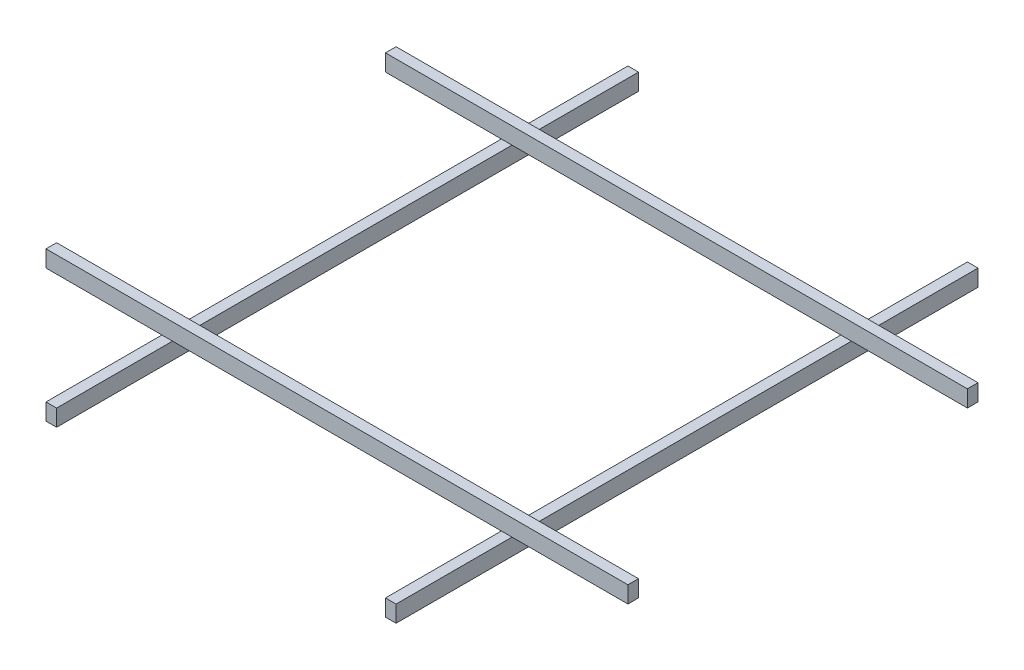
ISO-10303-21;
HEADER;
FILE_DESCRIPTION(('STEP AP214'),'2;1');
FILE_NAME('part.step','',(''),(''),'','','');
FILE_SCHEMA(('AUTOMOTIVE_DESIGN { 1 0 10303 214 1 1 1 1 }'));
ENDSEC;
DATA;
#1=APPLICATION_CONTEXT('core data for automotive mechanical design processes');
#2=APPLICATION_PROTOCOL_DEFINITION('international standard','automotive_design',2000,#1);
#3=PRODUCT_CONTEXT('',#1,'mechanical');
#4=PRODUCT('Part','Part','',(#3));
#5=PRODUCT_RELATED_PRODUCT_CATEGORY('part','',(#4));
#6=PRODUCT_DEFINITION_FORMATION('','',#4);
#7=PRODUCT_DEFINITION_CONTEXT('part definition',#1,'design');
#8=PRODUCT_DEFINITION('design','',#6,#7);
#9=PRODUCT_DEFINITION_SHAPE('','',#8);
#10=(LENGTH_UNIT() NAMED_UNIT(*) SI_UNIT(.MILLI.,.METRE.));
#11=(NAMED_UNIT(*) PLANE_ANGLE_UNIT() SI_UNIT($,.RADIAN.));
#12=(NAMED_UNIT(*) SI_UNIT($,.STERADIAN.) SOLID_ANGLE_UNIT());
#13=UNCERTAINTY_MEASURE_WITH_UNIT(LENGTH_MEASURE(1.E-05),#10,'distance_accuracy_value','');
#14=(GEOMETRIC_REPRESENTATION_CONTEXT(3) GLOBAL_UNCERTAINTY_ASSIGNED_CONTEXT((#13)) GLOBAL_UNIT_ASSIGNED_CONTEXT((#10,
#11,#12)) REPRESENTATION_CONTEXT('',''));
#15=CARTESIAN_POINT('',(0.,0.,0.));
#16=DIRECTION('',(0.,0.,1.));
#17=DIRECTION('',(1.,0.,0.));
#18=AXIS2_PLACEMENT_3D('',#15,#16,#17);
#19=CARTESIAN_POINT('',(4572.,209.55,-1060.45));
#20=DIRECTION('',(0.,0.,1.));
#21=DIRECTION('',(1.,0.,0.));
#22=AXIS2_PLACEMENT_3D('',#19,#20,#21);
#23=PLANE('',#22);
#24=DIRECTION('',(0.,1.,0.));
#25=VECTOR('',#24,1.);
#26=CARTESIAN_POINT('',(-304.8,209.55,-1060.45));
#27=LINE('',#26,#25);
#28=CARTESIAN_POINT('',(-304.8,69.85,-1060.45));
#29=VERTEX_POINT('',#28);
#30=CARTESIAN_POINT('',(-304.8,209.55,-1060.45));
#31=VERTEX_POINT('',#30);
#32=EDGE_CURVE('E128',#29,#31,#27,.T.);
#33=ORIENTED_EDGE('',*,*,#32,.T.);
#34=DIRECTION('',(-1.,0.,0.));
#35=VECTOR('',#34,1.);
#36=CARTESIAN_POINT('',(4572.,209.55,-1060.45));
#37=LINE('',#36,#35);
#38=CARTESIAN_POINT('',(4572.,209.55,-1060.45));
#39=VERTEX_POINT('',#38);
#40=EDGE_CURVE('E13',#39,#31,#37,.T.);
#41=ORIENTED_EDGE('',*,*,#40,.F.);
#42=DIRECTION('',(0.,1.,0.));
#43=VECTOR('',#42,1.);
#44=CARTESIAN_POINT('',(4572.,209.55,-1060.45));
#45=LINE('',#44,#43);
#46=CARTESIAN_POINT('',(4572.,69.85,-1060.45));
#47=VERTEX_POINT('',#46);
#48=EDGE_CURVE('E116',#47,#39,#45,.T.);
#49=ORIENTED_EDGE('',*,*,#48,.F.);
#50=DIRECTION('',(-1.,0.,0.));
#51=VECTOR('',#50,1.);
#52=CARTESIAN_POINT('',(4572.,69.85,-1060.45));
#53=LINE('',#52,#51);
#54=EDGE_CURVE('E124',#47,#29,#53,.T.);
#55=ORIENTED_EDGE('',*,*,#54,.T.);
#56=EDGE_LOOP('',(#33,#41,#49,#55));
#57=FACE_BOUND('',#56,.T.);
#58=ADVANCED_FACE('F65',(#57),#23,.F.);
#59=CARTESIAN_POINT('',(4572.,209.55,-971.549999999999));
#60=DIRECTION('',(0.,-1.,0.));
#61=DIRECTION('',(0.,0.,-1.));
#62=AXIS2_PLACEMENT_3D('',#59,#60,#61);
#63=PLANE('',#62);
#64=DIRECTION('',(0.,0.,1.));
#65=VECTOR('',#64,1.);
#66=CARTESIAN_POINT('',(-304.8,209.55,-971.549999999999));
#67=LINE('',#66,#65);
#68=CARTESIAN_POINT('',(-304.8,209.55,-971.549999999999));
#69=VERTEX_POINT('',#68);
#70=EDGE_CURVE('E120',#31,#69,#67,.T.);
#71=ORIENTED_EDGE('',*,*,#70,.T.);
#72=DIRECTION('',(-1.,0.,0.));
#73=VECTOR('',#72,1.);
#74=CARTESIAN_POINT('',(4572.,209.55,-971.549999999999));
#75=LINE('',#74,#73);
#76=CARTESIAN_POINT('',(4572.,209.55,-971.549999999999));
#77=VERTEX_POINT('',#76);
#78=EDGE_CURVE('E73',#77,#69,#75,.T.);
#79=ORIENTED_EDGE('',*,*,#78,.F.);
#80=DIRECTION('',(0.,0.,1.));
#81=VECTOR('',#80,1.);
#82=CARTESIAN_POINT('',(4572.,209.55,-971.549999999999));
#83=LINE('',#82,#81);
#84=EDGE_CURVE('E111',#39,#77,#83,.T.);
#85=ORIENTED_EDGE('',*,*,#84,.F.);
#86=ORIENTED_EDGE('',*,*,#40,.T.);
#87=EDGE_LOOP('',(#71,#79,#85,#86));
#88=FACE_BOUND('',#87,.T.);
#89=ADVANCED_FACE('F119',(#88),#63,.F.);
#90=CARTESIAN_POINT('',(4572.,209.55,-971.549999999999));
#91=DIRECTION('',(0.,0.,-1.));
#92=DIRECTION('',(-1.,0.,0.));
#93=AXIS2_PLACEMENT_3D('',#90,#91,#92);
#94=PLANE('',#93);
#95=DIRECTION('',(0.,-1.,0.));
#96=VECTOR('',#95,1.);
#97=CARTESIAN_POINT('',(-304.8,209.55,-971.549999999999));
#98=LINE('',#97,#96);
#99=CARTESIAN_POINT('',(-304.8,69.85,-971.549999999999));
#100=VERTEX_POINT('',#99);
#101=EDGE_CURVE('E98',#69,#100,#98,.T.);
#102=ORIENTED_EDGE('',*,*,#101,.T.);
#103=DIRECTION('',(-1.,0.,0.));
#104=VECTOR('',#103,1.);
#105=CARTESIAN_POINT('',(4572.,69.85,-971.549999999999));
#106=LINE('',#105,#104);
#107=CARTESIAN_POINT('',(4572.,69.85,-971.549999999999));
#108=VERTEX_POINT('',#107);
#109=EDGE_CURVE('E121',#108,#100,#106,.T.);
#110=ORIENTED_EDGE('',*,*,#109,.F.);
#111=DIRECTION('',(0.,-1.,0.));
#112=VECTOR('',#111,1.);
#113=CARTESIAN_POINT('',(4572.,209.55,-971.549999999999));
#114=LINE('',#113,#112);
#115=EDGE_CURVE('E114',#77,#108,#114,.T.);
#116=ORIENTED_EDGE('',*,*,#115,.F.);
#117=ORIENTED_EDGE('',*,*,#78,.T.);
#118=EDGE_LOOP('',(#102,#110,#116,#117));
#119=FACE_BOUND('',#118,.T.);
#120=ADVANCED_FACE('F122',(#119),#94,.F.);
#121=CARTESIAN_POINT('',(4572.,69.85,-971.549999999999));
#122=DIRECTION('',(0.,1.,0.));
#123=DIRECTION('',(0.,0.,1.));
#124=AXIS2_PLACEMENT_3D('',#121,#122,#123);
#125=PLANE('',#124);
#126=DIRECTION('',(0.,0.,-1.));
#127=VECTOR('',#126,1.);
#128=CARTESIAN_POINT('',(-304.8,69.85,-971.549999999999));
#129=LINE('',#128,#127);
#130=EDGE_CURVE('E104',#100,#29,#129,.T.);
#131=ORIENTED_EDGE('',*,*,#130,.T.);
#132=ORIENTED_EDGE('',*,*,#54,.F.);
#133=DIRECTION('',(0.,0.,-1.));
#134=VECTOR('',#133,1.);
#135=CARTESIAN_POINT('',(4572.,69.85,-971.549999999999));
#136=LINE('',#135,#134);
#137=EDGE_CURVE('E81',#108,#47,#136,.T.);
#138=ORIENTED_EDGE('',*,*,#137,.F.);
#139=ORIENTED_EDGE('',*,*,#109,.T.);
#140=EDGE_LOOP('',(#131,#132,#138,#139));
#141=FACE_BOUND('',#140,.T.);
#142=ADVANCED_FACE('F135',(#141),#125,.F.);
#143=CARTESIAN_POINT('',(4572.,139.7,-1727.2));
#144=DIRECTION('',(1.,0.,0.));
#145=DIRECTION('',(0.,0.,-1.));
#146=AXIS2_PLACEMENT_3D('',#143,#144,#145);
#147=PLANE('',#146);
#148=ORIENTED_EDGE('',*,*,#48,.T.);
#149=ORIENTED_EDGE('',*,*,#84,.T.);
#150=ORIENTED_EDGE('',*,*,#115,.T.);
#151=ORIENTED_EDGE('',*,*,#137,.T.);
#152=EDGE_LOOP('',(#148,#149,#150,#151));
#153=FACE_BOUND('',#152,.T.);
#154=ADVANCED_FACE('F112',(#153),#147,.T.);
#155=CARTESIAN_POINT('',(-304.8,139.7,-1727.2));
#156=DIRECTION('',(1.,0.,0.));
#157=DIRECTION('',(0.,0.,-1.));
#158=AXIS2_PLACEMENT_3D('',#155,#156,#157);
#159=PLANE('',#158);
#160=ORIENTED_EDGE('',*,*,#32,.F.);
#161=ORIENTED_EDGE('',*,*,#130,.F.);
#162=ORIENTED_EDGE('',*,*,#101,.F.);
#163=ORIENTED_EDGE('',*,*,#70,.F.);
#164=EDGE_LOOP('',(#160,#161,#162,#163));
#165=FACE_BOUND('',#164,.T.);
#166=ADVANCED_FACE('F138',(#165),#159,.F.);
#167=CLOSED_SHELL('',(#58,#89,#120,#142,#154,#166));
#168=MANIFOLD_SOLID_BREP('B2',#167);
#169=CARTESIAN_POINT('',(4572.,209.55,-3905.25));
#170=DIRECTION('',(0.,0.,1.));
#171=DIRECTION('',(1.,0.,0.));
#172=AXIS2_PLACEMENT_3D('',#169,#170,#171);
#173=PLANE('',#172);
#174=DIRECTION('',(0.,1.,0.));
#175=VECTOR('',#174,1.);
#176=CARTESIAN_POINT('',(-304.8,209.55,-3905.25));
#177=LINE('',#176,#175);
#178=CARTESIAN_POINT('',(-304.8,69.85,-3905.25));
#179=VERTEX_POINT('',#178);
#180=CARTESIAN_POINT('',(-304.8,209.55,-3905.25));
#181=VERTEX_POINT('',#180);
#182=EDGE_CURVE('E285',#179,#181,#177,.T.);
#183=ORIENTED_EDGE('',*,*,#182,.T.);
#184=DIRECTION('',(-1.,0.,0.));
#185=VECTOR('',#184,1.);
#186=CARTESIAN_POINT('',(4572.,209.55,-3905.25));
#187=LINE('',#186,#185);
#188=CARTESIAN_POINT('',(4572.,209.55,-3905.25));
#189=VERTEX_POINT('',#188);
#190=EDGE_CURVE('E63',#189,#181,#187,.T.);
#191=ORIENTED_EDGE('',*,*,#190,.F.);
#192=DIRECTION('',(0.,1.,0.));
#193=VECTOR('',#192,1.);
#194=CARTESIAN_POINT('',(4572.,209.55,-3905.25));
#195=LINE('',#194,#193);
#196=CARTESIAN_POINT('',(4572.,69.85,-3905.25));
#197=VERTEX_POINT('',#196);
#198=EDGE_CURVE('E273',#197,#189,#195,.T.);
#199=ORIENTED_EDGE('',*,*,#198,.F.);
#200=DIRECTION('',(-1.,0.,0.));
#201=VECTOR('',#200,1.);
#202=CARTESIAN_POINT('',(4572.,69.85,-3905.25));
#203=LINE('',#202,#201);
#204=EDGE_CURVE('E281',#197,#179,#203,.T.);
#205=ORIENTED_EDGE('',*,*,#204,.T.);
#206=EDGE_LOOP('',(#183,#191,#199,#205));
#207=FACE_BOUND('',#206,.T.);
#208=ADVANCED_FACE('F222',(#207),#173,.F.);
#209=CARTESIAN_POINT('',(4572.,209.55,-3816.35));
#210=DIRECTION('',(0.,-1.,0.));
#211=DIRECTION('',(0.,0.,-1.));
#212=AXIS2_PLACEMENT_3D('',#209,#210,#211);
#213=PLANE('',#212);
#214=DIRECTION('',(0.,0.,1.));
#215=VECTOR('',#214,1.);
#216=CARTESIAN_POINT('',(-304.8,209.55,-3816.35));
#217=LINE('',#216,#215);
#218=CARTESIAN_POINT('',(-304.8,209.55,-3816.35));
#219=VERTEX_POINT('',#218);
#220=EDGE_CURVE('E277',#181,#219,#217,.T.);
#221=ORIENTED_EDGE('',*,*,#220,.T.);
#222=DIRECTION('',(-1.,0.,0.));
#223=VECTOR('',#222,1.);
#224=CARTESIAN_POINT('',(4572.,209.55,-3816.35));
#225=LINE('',#224,#223);
#226=CARTESIAN_POINT('',(4572.,209.55,-3816.35));
#227=VERTEX_POINT('',#226);
#228=EDGE_CURVE('E230',#227,#219,#225,.T.);
#229=ORIENTED_EDGE('',*,*,#228,.F.);
#230=DIRECTION('',(0.,0.,1.));
#231=VECTOR('',#230,1.);
#232=CARTESIAN_POINT('',(4572.,209.55,-3816.35));
#233=LINE('',#232,#231);
#234=EDGE_CURVE('E268',#189,#227,#233,.T.);
#235=ORIENTED_EDGE('',*,*,#234,.F.);
#236=ORIENTED_EDGE('',*,*,#190,.T.);
#237=EDGE_LOOP('',(#221,#229,#235,#236));
#238=FACE_BOUND('',#237,.T.);
#239=ADVANCED_FACE('F276',(#238),#213,.F.);
#240=CARTESIAN_POINT('',(4572.,209.55,-3816.35));
#241=DIRECTION('',(0.,0.,-1.));
#242=DIRECTION('',(-1.,0.,0.));
#243=AXIS2_PLACEMENT_3D('',#240,#241,#242);
#244=PLANE('',#243);
#245=DIRECTION('',(0.,-1.,0.));
#246=VECTOR('',#245,1.);
#247=CARTESIAN_POINT('',(-304.8,209.55,-3816.35));
#248=LINE('',#247,#246);
#249=CARTESIAN_POINT('',(-304.8,69.85,-3816.35));
#250=VERTEX_POINT('',#249);
#251=EDGE_CURVE('E255',#219,#250,#248,.T.);
#252=ORIENTED_EDGE('',*,*,#251,.T.);
#253=DIRECTION('',(-1.,0.,0.));
#254=VECTOR('',#253,1.);
#255=CARTESIAN_POINT('',(4572.,69.85,-3816.35));
#256=LINE('',#255,#254);
#257=CARTESIAN_POINT('',(4572.,69.85,-3816.35));
#258=VERTEX_POINT('',#257);
#259=EDGE_CURVE('E278',#258,#250,#256,.T.);
#260=ORIENTED_EDGE('',*,*,#259,.F.);
#261=DIRECTION('',(0.,-1.,0.));
#262=VECTOR('',#261,1.);
#263=CARTESIAN_POINT('',(4572.,209.55,-3816.35));
#264=LINE('',#263,#262);
#265=EDGE_CURVE('E271',#227,#258,#264,.T.);
#266=ORIENTED_EDGE('',*,*,#265,.F.);
#267=ORIENTED_EDGE('',*,*,#228,.T.);
#268=EDGE_LOOP('',(#252,#260,#266,#267));
#269=FACE_BOUND('',#268,.T.);
#270=ADVANCED_FACE('F279',(#269),#244,.F.);
#271=CARTESIAN_POINT('',(4572.,69.85,-3816.35));
#272=DIRECTION('',(0.,1.,0.));
#273=DIRECTION('',(0.,0.,1.));
#274=AXIS2_PLACEMENT_3D('',#271,#272,#273);
#275=PLANE('',#274);
#276=DIRECTION('',(0.,0.,-1.));
#277=VECTOR('',#276,1.);
#278=CARTESIAN_POINT('',(-304.8,69.85,-3816.35));
#279=LINE('',#278,#277);
#280=EDGE_CURVE('E261',#250,#179,#279,.T.);
#281=ORIENTED_EDGE('',*,*,#280,.T.);
#282=ORIENTED_EDGE('',*,*,#204,.F.);
#283=DIRECTION('',(0.,0.,-1.));
#284=VECTOR('',#283,1.);
#285=CARTESIAN_POINT('',(4572.,69.85,-3816.35));
#286=LINE('',#285,#284);
#287=EDGE_CURVE('E238',#258,#197,#286,.T.);
#288=ORIENTED_EDGE('',*,*,#287,.F.);
#289=ORIENTED_EDGE('',*,*,#259,.T.);
#290=EDGE_LOOP('',(#281,#282,#288,#289));
#291=FACE_BOUND('',#290,.T.);
#292=ADVANCED_FACE('F292',(#291),#275,.F.);
#293=CARTESIAN_POINT('',(4572.,139.7,-4572.));
#294=DIRECTION('',(1.,0.,0.));
#295=DIRECTION('',(0.,0.,-1.));
#296=AXIS2_PLACEMENT_3D('',#293,#294,#295);
#297=PLANE('',#296);
#298=ORIENTED_EDGE('',*,*,#198,.T.);
#299=ORIENTED_EDGE('',*,*,#234,.T.);
#300=ORIENTED_EDGE('',*,*,#265,.T.);
#301=ORIENTED_EDGE('',*,*,#287,.T.);
#302=EDGE_LOOP('',(#298,#299,#300,#301));
#303=FACE_BOUND('',#302,.T.);
#304=ADVANCED_FACE('F269',(#303),#297,.T.);
#305=CARTESIAN_POINT('',(-304.8,139.7,-4572.));
#306=DIRECTION('',(1.,0.,0.));
#307=DIRECTION('',(0.,0.,-1.));
#308=AXIS2_PLACEMENT_3D('',#305,#306,#307);
#309=PLANE('',#308);
#310=ORIENTED_EDGE('',*,*,#182,.F.);
#311=ORIENTED_EDGE('',*,*,#280,.F.);
#312=ORIENTED_EDGE('',*,*,#251,.F.);
#313=ORIENTED_EDGE('',*,*,#220,.F.);
#314=EDGE_LOOP('',(#310,#311,#312,#313));
#315=FACE_BOUND('',#314,.T.);
#316=ADVANCED_FACE('F295',(#315),#309,.F.);
#317=CLOSED_SHELL('',(#208,#239,#270,#292,#304,#316));
#318=MANIFOLD_SOLID_BREP('B7',#317);
#319=CARTESIAN_POINT('',(3511.55,69.85,-4876.8));
#320=DIRECTION('',(1.,0.,0.));
#321=DIRECTION('',(0.,0.,-1.));
#322=AXIS2_PLACEMENT_3D('',#319,#320,#321);
#323=PLANE('',#322);
#324=DIRECTION('',(0.,1.,0.));
#325=VECTOR('',#324,1.);
#326=CARTESIAN_POINT('',(3511.55,69.85,1.30645320533039E-13));
#327=LINE('',#326,#325);
#328=CARTESIAN_POINT('',(3511.55,-69.85,1.30645320533039E-13));
#329=VERTEX_POINT('',#328);
#330=CARTESIAN_POINT('',(3511.55,69.85,1.30645320533039E-13));
#331=VERTEX_POINT('',#330);
#332=EDGE_CURVE('E441',#329,#331,#327,.T.);
#333=ORIENTED_EDGE('',*,*,#332,.T.);
#334=DIRECTION('',(0.,0.,1.));
#335=VECTOR('',#334,1.);
#336=CARTESIAN_POINT('',(3511.55,69.85,-4876.8));
#337=LINE('',#336,#335);
#338=CARTESIAN_POINT('',(3511.55,69.85,-4876.8));
#339=VERTEX_POINT('',#338);
#340=EDGE_CURVE('E220',#339,#331,#337,.T.);
#341=ORIENTED_EDGE('',*,*,#340,.F.);
#342=DIRECTION('',(0.,1.,0.));
#343=VECTOR('',#342,1.);
#344=CARTESIAN_POINT('',(3511.55,69.85,-4876.8));
#345=LINE('',#344,#343);
#346=CARTESIAN_POINT('',(3511.55,-69.85,-4876.8));
#347=VERTEX_POINT('',#346);
#348=EDGE_CURVE('E429',#347,#339,#345,.T.);
#349=ORIENTED_EDGE('',*,*,#348,.F.);
#350=DIRECTION('',(0.,0.,1.));
#351=VECTOR('',#350,1.);
#352=CARTESIAN_POINT('',(3511.55,-69.85,-4876.8));
#353=LINE('',#352,#351);
#354=EDGE_CURVE('E437',#347,#329,#353,.T.);
#355=ORIENTED_EDGE('',*,*,#354,.T.);
#356=EDGE_LOOP('',(#333,#341,#349,#355));
#357=FACE_BOUND('',#356,.T.);
#358=ADVANCED_FACE('F378',(#357),#323,.F.);
#359=CARTESIAN_POINT('',(3600.45,69.85,-4876.8));
#360=DIRECTION('',(0.,-1.,0.));
#361=DIRECTION('',(0.,0.,-1.));
#362=AXIS2_PLACEMENT_3D('',#359,#360,#361);
#363=PLANE('',#362);
#364=DIRECTION('',(1.,0.,0.));
#365=VECTOR('',#364,1.);
#366=CARTESIAN_POINT('',(3600.45,69.85,1.30645320533039E-13));
#367=LINE('',#366,#365);
#368=CARTESIAN_POINT('',(3600.45,69.85,1.30645320533039E-13));
#369=VERTEX_POINT('',#368);
#370=EDGE_CURVE('E433',#331,#369,#367,.T.);
#371=ORIENTED_EDGE('',*,*,#370,.T.);
#372=DIRECTION('',(0.,0.,1.));
#373=VECTOR('',#372,1.);
#374=CARTESIAN_POINT('',(3600.45,69.85,-4876.8));
#375=LINE('',#374,#373);
#376=CARTESIAN_POINT('',(3600.45,69.85,-4876.8));
#377=VERTEX_POINT('',#376);
#378=EDGE_CURVE('E386',#377,#369,#375,.T.);
#379=ORIENTED_EDGE('',*,*,#378,.F.);
#380=DIRECTION('',(1.,0.,0.));
#381=VECTOR('',#380,1.);
#382=CARTESIAN_POINT('',(3600.45,69.85,-4876.8));
#383=LINE('',#382,#381);
#384=EDGE_CURVE('E424',#339,#377,#383,.T.);
#385=ORIENTED_EDGE('',*,*,#384,.F.);
#386=ORIENTED_EDGE('',*,*,#340,.T.);
#387=EDGE_LOOP('',(#371,#379,#385,#386));
#388=FACE_BOUND('',#387,.T.);
#389=ADVANCED_FACE('F432',(#388),#363,.F.);
#390=CARTESIAN_POINT('',(3600.45,69.85,-4876.8));
#391=DIRECTION('',(-1.,0.,0.));
#392=DIRECTION('',(0.,0.,1.));
#393=AXIS2_PLACEMENT_3D('',#390,#391,#392);
#394=PLANE('',#393);
#395=DIRECTION('',(0.,-1.,0.));
#396=VECTOR('',#395,1.);
#397=CARTESIAN_POINT('',(3600.45,69.85,1.30645320533039E-13));
#398=LINE('',#397,#396);
#399=CARTESIAN_POINT('',(3600.45,-69.85,1.30645320533039E-13));
#400=VERTEX_POINT('',#399);
#401=EDGE_CURVE('E411',#369,#400,#398,.T.);
#402=ORIENTED_EDGE('',*,*,#401,.T.);
#403=DIRECTION('',(0.,0.,1.));
#404=VECTOR('',#403,1.);
#405=CARTESIAN_POINT('',(3600.45,-69.85,-4876.8));
#406=LINE('',#405,#404);
#407=CARTESIAN_POINT('',(3600.45,-69.85,-4876.8));
#408=VERTEX_POINT('',#407);
#409=EDGE_CURVE('E434',#408,#400,#406,.T.);
#410=ORIENTED_EDGE('',*,*,#409,.F.);
#411=DIRECTION('',(0.,-1.,0.));
#412=VECTOR('',#411,1.);
#413=CARTESIAN_POINT('',(3600.45,69.85,-4876.8));
#414=LINE('',#413,#412);
#415=EDGE_CURVE('E427',#377,#408,#414,.T.);
#416=ORIENTED_EDGE('',*,*,#415,.F.);
#417=ORIENTED_EDGE('',*,*,#378,.T.);
#418=EDGE_LOOP('',(#402,#410,#416,#417));
#419=FACE_BOUND('',#418,.T.);
#420=ADVANCED_FACE('F435',(#419),#394,.F.);
#421=CARTESIAN_POINT('',(3600.45,-69.85,-4876.8));
#422=DIRECTION('',(0.,1.,0.));
#423=DIRECTION('',(0.,0.,1.));
#424=AXIS2_PLACEMENT_3D('',#421,#422,#423);
#425=PLANE('',#424);
#426=DIRECTION('',(-1.,0.,0.));
#427=VECTOR('',#426,1.);
#428=CARTESIAN_POINT('',(3600.45,-69.85,1.30645320533039E-13));
#429=LINE('',#428,#427);
#430=EDGE_CURVE('E417',#400,#329,#429,.T.);
#431=ORIENTED_EDGE('',*,*,#430,.T.);
#432=ORIENTED_EDGE('',*,*,#354,.F.);
#433=DIRECTION('',(-1.,0.,0.));
#434=VECTOR('',#433,1.);
#435=CARTESIAN_POINT('',(3600.45,-69.85,-4876.8));
#436=LINE('',#435,#434);
#437=EDGE_CURVE('E394',#408,#347,#436,.T.);
#438=ORIENTED_EDGE('',*,*,#437,.F.);
#439=ORIENTED_EDGE('',*,*,#409,.T.);
#440=EDGE_LOOP('',(#431,#432,#438,#439));
#441=FACE_BOUND('',#440,.T.);
#442=ADVANCED_FACE('F448',(#441),#425,.F.);
#443=CARTESIAN_POINT('',(2844.8,0.,-4876.8));
#444=DIRECTION('',(0.,0.,-1.));
#445=DIRECTION('',(-1.,0.,0.));
#446=AXIS2_PLACEMENT_3D('',#443,#444,#445);
#447=PLANE('',#446);
#448=ORIENTED_EDGE('',*,*,#348,.T.);
#449=ORIENTED_EDGE('',*,*,#384,.T.);
#450=ORIENTED_EDGE('',*,*,#415,.T.);
#451=ORIENTED_EDGE('',*,*,#437,.T.);
#452=EDGE_LOOP('',(#448,#449,#450,#451));
#453=FACE_BOUND('',#452,.T.);
#454=ADVANCED_FACE('F425',(#453),#447,.T.);
#455=CARTESIAN_POINT('',(2844.8,0.,1.30645320533039E-13));
#456=DIRECTION('',(0.,0.,-1.));
#457=DIRECTION('',(-1.,0.,0.));
#458=AXIS2_PLACEMENT_3D('',#455,#456,#457);
#459=PLANE('',#458);
#460=ORIENTED_EDGE('',*,*,#332,.F.);
#461=ORIENTED_EDGE('',*,*,#430,.F.);
#462=ORIENTED_EDGE('',*,*,#401,.F.);
#463=ORIENTED_EDGE('',*,*,#370,.F.);
#464=EDGE_LOOP('',(#460,#461,#462,#463));
#465=FACE_BOUND('',#464,.T.);
#466=ADVANCED_FACE('F451',(#465),#459,.F.);
#467=CLOSED_SHELL('',(#358,#389,#420,#442,#454,#466));
#468=MANIFOLD_SOLID_BREP('B57',#467);
#469=CARTESIAN_POINT('',(666.75,69.85,-4876.8));
#470=DIRECTION('',(1.,0.,0.));
#471=DIRECTION('',(0.,0.,-1.));
#472=AXIS2_PLACEMENT_3D('',#469,#470,#471);
#473=PLANE('',#472);
#474=DIRECTION('',(0.,1.,0.));
#475=VECTOR('',#474,1.);
#476=CARTESIAN_POINT('',(666.75,69.85,8.88178419700125E-13));
#477=LINE('',#476,#475);
#478=CARTESIAN_POINT('',(666.75,-69.85,8.88178419700125E-13));
#479=VERTEX_POINT('',#478);
#480=CARTESIAN_POINT('',(666.75,69.85,8.88178419700125E-13));
#481=VERTEX_POINT('',#480);
#482=EDGE_CURVE('E588',#479,#481,#477,.T.);
#483=ORIENTED_EDGE('',*,*,#482,.T.);
#484=DIRECTION('',(0.,0.,1.));
#485=VECTOR('',#484,1.);
#486=CARTESIAN_POINT('',(666.75,69.85,-4876.8));
#487=LINE('',#486,#485);
#488=CARTESIAN_POINT('',(666.75,69.85,-4876.8));
#489=VERTEX_POINT('',#488);
#490=EDGE_CURVE('E376',#489,#481,#487,.T.);
#491=ORIENTED_EDGE('',*,*,#490,.F.);
#492=DIRECTION('',(0.,1.,0.));
#493=VECTOR('',#492,1.);
#494=CARTESIAN_POINT('',(666.75,69.85,-4876.8));
#495=LINE('',#494,#493);
#496=CARTESIAN_POINT('',(666.75,-69.85,-4876.8));
#497=VERTEX_POINT('',#496);
#498=EDGE_CURVE('E576',#497,#489,#495,.T.);
#499=ORIENTED_EDGE('',*,*,#498,.F.);
#500=DIRECTION('',(0.,0.,1.));
#501=VECTOR('',#500,1.);
#502=CARTESIAN_POINT('',(666.75,-69.85,-4876.8));
#503=LINE('',#502,#501);
#504=EDGE_CURVE('E584',#497,#479,#503,.T.);
#505=ORIENTED_EDGE('',*,*,#504,.T.);
#506=EDGE_LOOP('',(#483,#491,#499,#505));
#507=FACE_BOUND('',#506,.T.);
#508=ADVANCED_FACE('F525',(#507),#473,.F.);
#509=CARTESIAN_POINT('',(755.65,69.85,-4876.8));
#510=DIRECTION('',(0.,-1.,0.));
#511=DIRECTION('',(0.,0.,-1.));
#512=AXIS2_PLACEMENT_3D('',#509,#510,#511);
#513=PLANE('',#512);
#514=DIRECTION('',(1.,0.,0.));
#515=VECTOR('',#514,1.);
#516=CARTESIAN_POINT('',(755.65,69.85,8.88178419700125E-13));
#517=LINE('',#516,#515);
#518=CARTESIAN_POINT('',(755.65,69.85,8.88178419700125E-13));
#519=VERTEX_POINT('',#518);
#520=EDGE_CURVE('E580',#481,#519,#517,.T.);
#521=ORIENTED_EDGE('',*,*,#520,.T.);
#522=DIRECTION('',(0.,0.,1.));
#523=VECTOR('',#522,1.);
#524=CARTESIAN_POINT('',(755.65,69.85,-4876.8));
#525=LINE('',#524,#523);
#526=CARTESIAN_POINT('',(755.65,69.85,-4876.8));
#527=VERTEX_POINT('',#526);
#528=EDGE_CURVE('E533',#527,#519,#525,.T.);
#529=ORIENTED_EDGE('',*,*,#528,.F.);
#530=DIRECTION('',(1.,0.,0.));
#531=VECTOR('',#530,1.);
#532=CARTESIAN_POINT('',(755.65,69.85,-4876.8));
#533=LINE('',#532,#531);
#534=EDGE_CURVE('E571',#489,#527,#533,.T.);
#535=ORIENTED_EDGE('',*,*,#534,.F.);
#536=ORIENTED_EDGE('',*,*,#490,.T.);
#537=EDGE_LOOP('',(#521,#529,#535,#536));
#538=FACE_BOUND('',#537,.T.);
#539=ADVANCED_FACE('F579',(#538),#513,.F.);
#540=CARTESIAN_POINT('',(755.65,69.85,-4876.8));
#541=DIRECTION('',(-1.,0.,0.));
#542=DIRECTION('',(0.,0.,1.));
#543=AXIS2_PLACEMENT_3D('',#540,#541,#542);
#544=PLANE('',#543);
#545=DIRECTION('',(0.,-1.,0.));
#546=VECTOR('',#545,1.);
#547=CARTESIAN_POINT('',(755.65,69.85,8.88178419700125E-13));
#548=LINE('',#547,#546);
#549=CARTESIAN_POINT('',(755.65,-69.85,8.88178419700125E-13));
#550=VERTEX_POINT('',#549);
#551=EDGE_CURVE('E558',#519,#550,#548,.T.);
#552=ORIENTED_EDGE('',*,*,#551,.T.);
#553=DIRECTION('',(0.,0.,1.));
#554=VECTOR('',#553,1.);
#555=CARTESIAN_POINT('',(755.65,-69.85,-4876.8));
#556=LINE('',#555,#554);
#557=CARTESIAN_POINT('',(755.65,-69.85,-4876.8));
#558=VERTEX_POINT('',#557);
#559=EDGE_CURVE('E581',#558,#550,#556,.T.);
#560=ORIENTED_EDGE('',*,*,#559,.F.);
#561=DIRECTION('',(0.,-1.,0.));
#562=VECTOR('',#561,1.);
#563=CARTESIAN_POINT('',(755.65,69.85,-4876.8));
#564=LINE('',#563,#562);
#565=EDGE_CURVE('E574',#527,#558,#564,.T.);
#566=ORIENTED_EDGE('',*,*,#565,.F.);
#567=ORIENTED_EDGE('',*,*,#528,.T.);
#568=EDGE_LOOP('',(#552,#560,#566,#567));
#569=FACE_BOUND('',#568,.T.);
#570=ADVANCED_FACE('F582',(#569),#544,.F.);
#571=CARTESIAN_POINT('',(755.65,-69.85,-4876.8));
#572=DIRECTION('',(0.,1.,0.));
#573=DIRECTION('',(0.,0.,1.));
#574=AXIS2_PLACEMENT_3D('',#571,#572,#573);
#575=PLANE('',#574);
#576=DIRECTION('',(-1.,0.,0.));
#577=VECTOR('',#576,1.);
#578=CARTESIAN_POINT('',(755.65,-69.85,8.88178419700125E-13));
#579=LINE('',#578,#577);
#580=EDGE_CURVE('E564',#550,#479,#579,.T.);
#581=ORIENTED_EDGE('',*,*,#580,.T.);
#582=ORIENTED_EDGE('',*,*,#504,.F.);
#583=DIRECTION('',(-1.,0.,0.));
#584=VECTOR('',#583,1.);
#585=CARTESIAN_POINT('',(755.65,-69.85,-4876.8));
#586=LINE('',#585,#584);
#587=EDGE_CURVE('E541',#558,#497,#586,.T.);
#588=ORIENTED_EDGE('',*,*,#587,.F.);
#589=ORIENTED_EDGE('',*,*,#559,.T.);
#590=EDGE_LOOP('',(#581,#582,#588,#589));
#591=FACE_BOUND('',#590,.T.);
#592=ADVANCED_FACE('F595',(#591),#575,.F.);
#593=CARTESIAN_POINT('',(0.,0.,-4876.8));
#594=DIRECTION('',(0.,0.,-1.));
#595=DIRECTION('',(-1.,0.,0.));
#596=AXIS2_PLACEMENT_3D('',#593,#594,#595);
#597=PLANE('',#596);
#598=ORIENTED_EDGE('',*,*,#498,.T.);
#599=ORIENTED_EDGE('',*,*,#534,.T.);
#600=ORIENTED_EDGE('',*,*,#565,.T.);
#601=ORIENTED_EDGE('',*,*,#587,.T.);
#602=EDGE_LOOP('',(#598,#599,#600,#601));
#603=FACE_BOUND('',#602,.T.);
#604=ADVANCED_FACE('F572',(#603),#597,.T.);
#605=CARTESIAN_POINT('',(0.,0.,8.88178419700125E-13));
#606=DIRECTION('',(0.,0.,-1.));
#607=DIRECTION('',(-1.,0.,0.));
#608=AXIS2_PLACEMENT_3D('',#605,#606,#607);
#609=PLANE('',#608);
#610=ORIENTED_EDGE('',*,*,#482,.F.);
#611=ORIENTED_EDGE('',*,*,#580,.F.);
#612=ORIENTED_EDGE('',*,*,#551,.F.);
#613=ORIENTED_EDGE('',*,*,#520,.F.);
#614=EDGE_LOOP('',(#610,#611,#612,#613));
#615=FACE_BOUND('',#614,.T.);
#616=ADVANCED_FACE('F598',(#615),#609,.F.);
#617=CLOSED_SHELL('',(#508,#539,#570,#592,#604,#616));
#618=MANIFOLD_SOLID_BREP('B214',#617);
#619=ADVANCED_BREP_SHAPE_REPRESENTATION('',(#18,#168,#318,#468,#618),#14);
#620=SHAPE_DEFINITION_REPRESENTATION(#9,#619);
ENDSEC;
END-ISO-10303-21;
